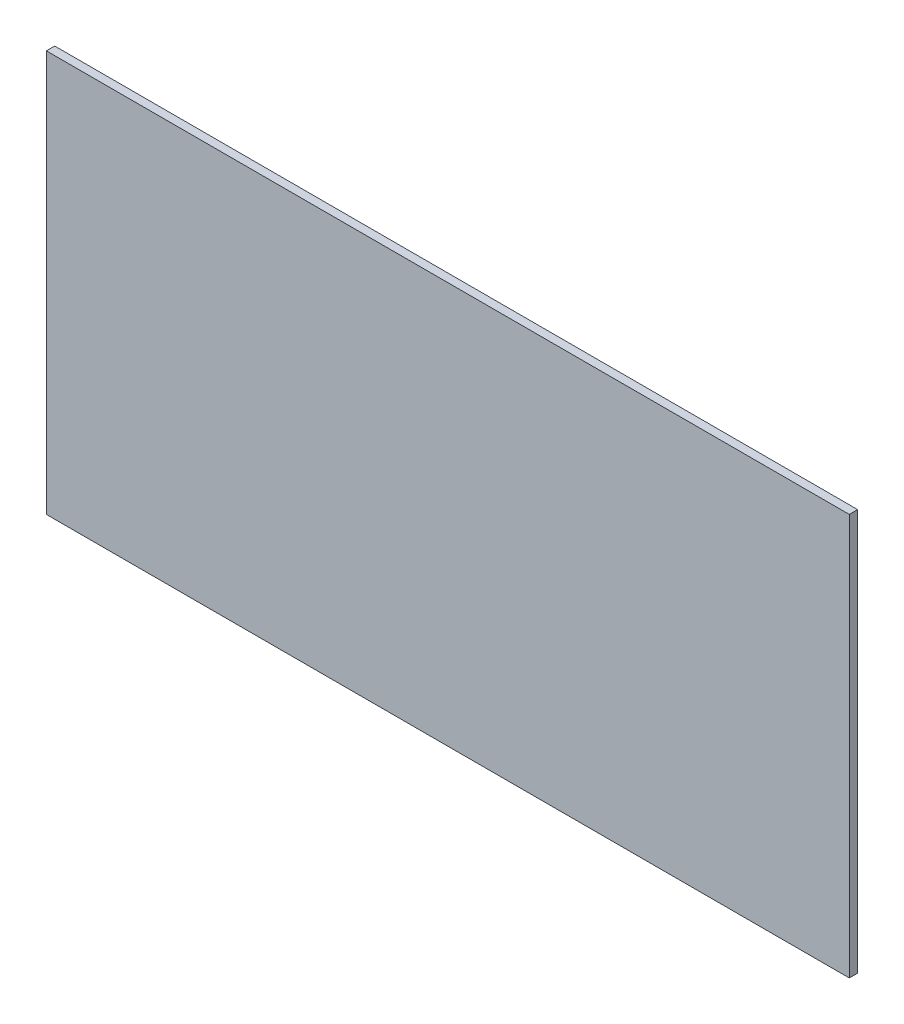
ISO-10303-21;
HEADER;
FILE_DESCRIPTION(('STEP AP214'),'2;1');
FILE_NAME('part.step','',(''),(''),'','','');
FILE_SCHEMA(('AUTOMOTIVE_DESIGN { 1 0 10303 214 1 1 1 1 }'));
ENDSEC;
DATA;
#1=APPLICATION_CONTEXT('core data for automotive mechanical design processes');
#2=APPLICATION_PROTOCOL_DEFINITION('international standard','automotive_design',2000,#1);
#3=PRODUCT_CONTEXT('',#1,'mechanical');
#4=PRODUCT('Part','Part','',(#3));
#5=PRODUCT_RELATED_PRODUCT_CATEGORY('part','',(#4));
#6=PRODUCT_DEFINITION_FORMATION('','',#4);
#7=PRODUCT_DEFINITION_CONTEXT('part definition',#1,'design');
#8=PRODUCT_DEFINITION('design','',#6,#7);
#9=PRODUCT_DEFINITION_SHAPE('','',#8);
#10=(LENGTH_UNIT() NAMED_UNIT(*) SI_UNIT(.MILLI.,.METRE.));
#11=(NAMED_UNIT(*) PLANE_ANGLE_UNIT() SI_UNIT($,.RADIAN.));
#12=(NAMED_UNIT(*) SI_UNIT($,.STERADIAN.) SOLID_ANGLE_UNIT());
#13=UNCERTAINTY_MEASURE_WITH_UNIT(LENGTH_MEASURE(1.E-05),#10,'distance_accuracy_value','');
#14=(GEOMETRIC_REPRESENTATION_CONTEXT(3) GLOBAL_UNCERTAINTY_ASSIGNED_CONTEXT((#13)) GLOBAL_UNIT_ASSIGNED_CONTEXT((#10,
#11,#12)) REPRESENTATION_CONTEXT('',''));
#15=CARTESIAN_POINT('',(0.,0.,0.));
#16=DIRECTION('',(0.,0.,1.));
#17=DIRECTION('',(1.,0.,0.));
#18=AXIS2_PLACEMENT_3D('',#15,#16,#17);
#19=CARTESIAN_POINT('',(304.8,152.4,6.35));
#20=DIRECTION('',(-1.,0.,0.));
#21=DIRECTION('',(0.,-1.,0.));
#22=AXIS2_PLACEMENT_3D('',#19,#20,#21);
#23=PLANE('',#22);
#24=DIRECTION('',(0.,1.,0.));
#25=VECTOR('',#24,1.);
#26=CARTESIAN_POINT('',(304.8,152.4,0.));
#27=LINE('',#26,#25);
#28=CARTESIAN_POINT('',(304.8,-152.4,0.));
#29=VERTEX_POINT('',#28);
#30=CARTESIAN_POINT('',(304.8,152.4,0.));
#31=VERTEX_POINT('',#30);
#32=EDGE_CURVE('E102',#29,#31,#27,.T.);
#33=ORIENTED_EDGE('',*,*,#32,.T.);
#34=DIRECTION('',(0.,0.,-1.));
#35=VECTOR('',#34,1.);
#36=CARTESIAN_POINT('',(304.8,152.4,6.35));
#37=LINE('',#36,#35);
#38=CARTESIAN_POINT('',(304.8,152.4,6.35));
#39=VERTEX_POINT('',#38);
#40=EDGE_CURVE('E11',#39,#31,#37,.T.);
#41=ORIENTED_EDGE('',*,*,#40,.F.);
#42=DIRECTION('',(0.,1.,0.));
#43=VECTOR('',#42,1.);
#44=CARTESIAN_POINT('',(304.8,152.4,6.35));
#45=LINE('',#44,#43);
#46=CARTESIAN_POINT('',(304.8,-152.4,6.35));
#47=VERTEX_POINT('',#46);
#48=EDGE_CURVE('E90',#47,#39,#45,.T.);
#49=ORIENTED_EDGE('',*,*,#48,.F.);
#50=DIRECTION('',(0.,0.,-1.));
#51=VECTOR('',#50,1.);
#52=CARTESIAN_POINT('',(304.8,-152.4,6.35));
#53=LINE('',#52,#51);
#54=EDGE_CURVE('E98',#47,#29,#53,.T.);
#55=ORIENTED_EDGE('',*,*,#54,.T.);
#56=EDGE_LOOP('',(#33,#41,#49,#55));
#57=FACE_BOUND('',#56,.T.);
#58=ADVANCED_FACE('F39',(#57),#23,.F.);
#59=CARTESIAN_POINT('',(-304.8,152.4,6.35));
#60=DIRECTION('',(0.,-1.,0.));
#61=DIRECTION('',(0.,0.,-1.));
#62=AXIS2_PLACEMENT_3D('',#59,#60,#61);
#63=PLANE('',#62);
#64=DIRECTION('',(-1.,0.,0.));
#65=VECTOR('',#64,1.);
#66=CARTESIAN_POINT('',(-304.8,152.4,0.));
#67=LINE('',#66,#65);
#68=CARTESIAN_POINT('',(-304.8,152.4,0.));
#69=VERTEX_POINT('',#68);
#70=EDGE_CURVE('E94',#31,#69,#67,.T.);
#71=ORIENTED_EDGE('',*,*,#70,.T.);
#72=DIRECTION('',(0.,0.,-1.));
#73=VECTOR('',#72,1.);
#74=CARTESIAN_POINT('',(-304.8,152.4,6.35));
#75=LINE('',#74,#73);
#76=CARTESIAN_POINT('',(-304.8,152.4,6.35));
#77=VERTEX_POINT('',#76);
#78=EDGE_CURVE('E47',#77,#69,#75,.T.);
#79=ORIENTED_EDGE('',*,*,#78,.F.);
#80=DIRECTION('',(-1.,0.,0.));
#81=VECTOR('',#80,1.);
#82=CARTESIAN_POINT('',(-304.8,152.4,6.35));
#83=LINE('',#82,#81);
#84=EDGE_CURVE('E85',#39,#77,#83,.T.);
#85=ORIENTED_EDGE('',*,*,#84,.F.);
#86=ORIENTED_EDGE('',*,*,#40,.T.);
#87=EDGE_LOOP('',(#71,#79,#85,#86));
#88=FACE_BOUND('',#87,.T.);
#89=ADVANCED_FACE('F93',(#88),#63,.F.);
#90=CARTESIAN_POINT('',(-304.8,152.4,6.35));
#91=DIRECTION('',(1.,0.,0.));
#92=DIRECTION('',(0.,1.,0.));
#93=AXIS2_PLACEMENT_3D('',#90,#91,#92);
#94=PLANE('',#93);
#95=DIRECTION('',(0.,-1.,0.));
#96=VECTOR('',#95,1.);
#97=CARTESIAN_POINT('',(-304.8,152.4,0.));
#98=LINE('',#97,#96);
#99=CARTESIAN_POINT('',(-304.8,-152.4,0.));
#100=VERTEX_POINT('',#99);
#101=EDGE_CURVE('E72',#69,#100,#98,.T.);
#102=ORIENTED_EDGE('',*,*,#101,.T.);
#103=DIRECTION('',(0.,0.,-1.));
#104=VECTOR('',#103,1.);
#105=CARTESIAN_POINT('',(-304.8,-152.4,6.35));
#106=LINE('',#105,#104);
#107=CARTESIAN_POINT('',(-304.8,-152.4,6.35));
#108=VERTEX_POINT('',#107);
#109=EDGE_CURVE('E95',#108,#100,#106,.T.);
#110=ORIENTED_EDGE('',*,*,#109,.F.);
#111=DIRECTION('',(0.,-1.,0.));
#112=VECTOR('',#111,1.);
#113=CARTESIAN_POINT('',(-304.8,152.4,6.35));
#114=LINE('',#113,#112);
#115=EDGE_CURVE('E88',#77,#108,#114,.T.);
#116=ORIENTED_EDGE('',*,*,#115,.F.);
#117=ORIENTED_EDGE('',*,*,#78,.T.);
#118=EDGE_LOOP('',(#102,#110,#116,#117));
#119=FACE_BOUND('',#118,.T.);
#120=ADVANCED_FACE('F96',(#119),#94,.F.);
#121=CARTESIAN_POINT('',(-304.8,-152.4,6.35));
#122=DIRECTION('',(0.,1.,0.));
#123=DIRECTION('',(0.,0.,1.));
#124=AXIS2_PLACEMENT_3D('',#121,#122,#123);
#125=PLANE('',#124);
#126=DIRECTION('',(1.,0.,0.));
#127=VECTOR('',#126,1.);
#128=CARTESIAN_POINT('',(-304.8,-152.4,0.));
#129=LINE('',#128,#127);
#130=EDGE_CURVE('E78',#100,#29,#129,.T.);
#131=ORIENTED_EDGE('',*,*,#130,.T.);
#132=ORIENTED_EDGE('',*,*,#54,.F.);
#133=DIRECTION('',(1.,0.,0.));
#134=VECTOR('',#133,1.);
#135=CARTESIAN_POINT('',(-304.8,-152.4,6.35));
#136=LINE('',#135,#134);
#137=EDGE_CURVE('E55',#108,#47,#136,.T.);
#138=ORIENTED_EDGE('',*,*,#137,.F.);
#139=ORIENTED_EDGE('',*,*,#109,.T.);
#140=EDGE_LOOP('',(#131,#132,#138,#139));
#141=FACE_BOUND('',#140,.T.);
#142=ADVANCED_FACE('F109',(#141),#125,.F.);
#143=CARTESIAN_POINT('',(0.,0.,6.35));
#144=DIRECTION('',(0.,0.,1.));
#145=DIRECTION('',(1.,0.,0.));
#146=AXIS2_PLACEMENT_3D('',#143,#144,#145);
#147=PLANE('',#146);
#148=ORIENTED_EDGE('',*,*,#48,.T.);
#149=ORIENTED_EDGE('',*,*,#84,.T.);
#150=ORIENTED_EDGE('',*,*,#115,.T.);
#151=ORIENTED_EDGE('',*,*,#137,.T.);
#152=EDGE_LOOP('',(#148,#149,#150,#151));
#153=FACE_BOUND('',#152,.T.);
#154=ADVANCED_FACE('F86',(#153),#147,.T.);
#155=CARTESIAN_POINT('',(0.,0.,0.));
#156=DIRECTION('',(0.,0.,1.));
#157=DIRECTION('',(1.,0.,0.));
#158=AXIS2_PLACEMENT_3D('',#155,#156,#157);
#159=PLANE('',#158);
#160=ORIENTED_EDGE('',*,*,#32,.F.);
#161=ORIENTED_EDGE('',*,*,#130,.F.);
#162=ORIENTED_EDGE('',*,*,#101,.F.);
#163=ORIENTED_EDGE('',*,*,#70,.F.);
#164=EDGE_LOOP('',(#160,#161,#162,#163));
#165=FACE_BOUND('',#164,.T.);
#166=ADVANCED_FACE('F112',(#165),#159,.F.);
#167=CLOSED_SHELL('',(#58,#89,#120,#142,#154,#166));
#168=MANIFOLD_SOLID_BREP('B2',#167);
#169=ADVANCED_BREP_SHAPE_REPRESENTATION('',(#18,#168),#14);
#170=SHAPE_DEFINITION_REPRESENTATION(#9,#169);
ENDSEC;
END-ISO-10303-21;
